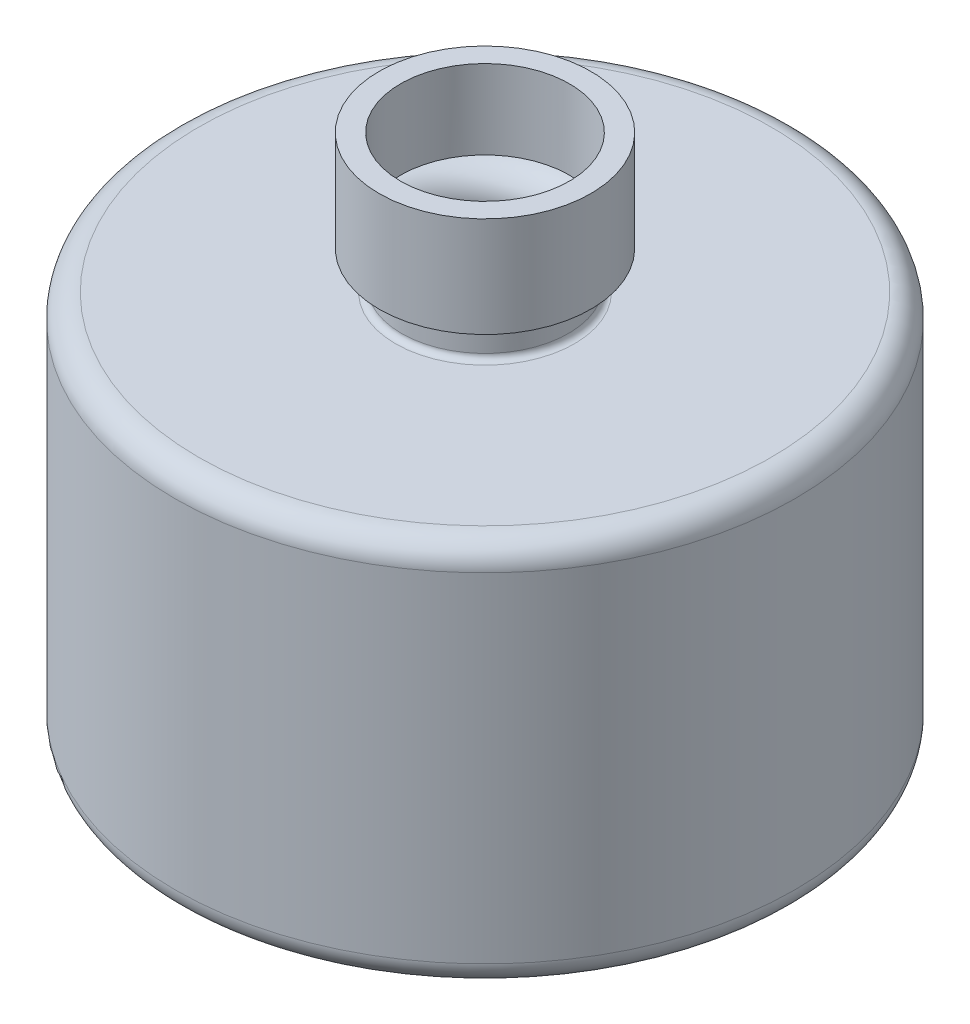
ISO-10303-21;
HEADER;
FILE_DESCRIPTION(('STEP AP214'),'2;1');
FILE_NAME('part.step','',(''),(''),'','','');
FILE_SCHEMA(('AUTOMOTIVE_DESIGN { 1 0 10303 214 1 1 1 1 }'));
ENDSEC;
DATA;
#1=APPLICATION_CONTEXT('core data for automotive mechanical design processes');
#2=APPLICATION_PROTOCOL_DEFINITION('international standard','automotive_design',2000,#1);
#3=PRODUCT_CONTEXT('',#1,'mechanical');
#4=PRODUCT('Part','Part','',(#3));
#5=PRODUCT_RELATED_PRODUCT_CATEGORY('part','',(#4));
#6=PRODUCT_DEFINITION_FORMATION('','',#4);
#7=PRODUCT_DEFINITION_CONTEXT('part definition',#1,'design');
#8=PRODUCT_DEFINITION('design','',#6,#7);
#9=PRODUCT_DEFINITION_SHAPE('','',#8);
#10=(LENGTH_UNIT() NAMED_UNIT(*) SI_UNIT(.MILLI.,.METRE.));
#11=(NAMED_UNIT(*) PLANE_ANGLE_UNIT() SI_UNIT($,.RADIAN.));
#12=(NAMED_UNIT(*) SI_UNIT($,.STERADIAN.) SOLID_ANGLE_UNIT());
#13=UNCERTAINTY_MEASURE_WITH_UNIT(LENGTH_MEASURE(1.E-05),#10,'distance_accuracy_value','');
#14=(GEOMETRIC_REPRESENTATION_CONTEXT(3) GLOBAL_UNCERTAINTY_ASSIGNED_CONTEXT((#13)) GLOBAL_UNIT_ASSIGNED_CONTEXT((#10,
#11,#12)) REPRESENTATION_CONTEXT('',''));
#15=CARTESIAN_POINT('',(0.,0.,0.));
#16=DIRECTION('',(0.,0.,1.));
#17=DIRECTION('',(1.,0.,0.));
#18=AXIS2_PLACEMENT_3D('',#15,#16,#17);
#19=CARTESIAN_POINT('',(0.,0.,0.));
#20=DIRECTION('',(0.,-1.,0.));
#21=DIRECTION('',(0.,0.,-1.));
#22=AXIS2_PLACEMENT_3D('',#19,#20,#21);
#23=PLANE('',#22);
#24=CARTESIAN_POINT('',(0.,0.,0.));
#25=DIRECTION('',(0.,-1.,0.));
#26=DIRECTION('',(0.,0.,-1.));
#27=AXIS2_PLACEMENT_3D('',#24,#25,#26);
#28=CIRCLE('',#27,15.24);
#29=CARTESIAN_POINT('',(0.,0.,-15.24));
#30=VERTEX_POINT('',#29);
#31=EDGE_CURVE('E58',#30,#30,#28,.T.);
#32=ORIENTED_EDGE('',*,*,#31,.T.);
#33=EDGE_LOOP('',(#32));
#34=FACE_BOUND('',#33,.T.);
#35=ADVANCED_FACE('F35',(#34),#23,.T.);
#36=CARTESIAN_POINT('',(0.,27.94,0.));
#37=DIRECTION('',(0.,1.,0.));
#38=DIRECTION('',(0.,0.,1.));
#39=AXIS2_PLACEMENT_3D('',#36,#37,#38);
#40=CYLINDRICAL_SURFACE('',#39,16.51);
#41=CARTESIAN_POINT('',(0.,1.27,0.));
#42=DIRECTION('',(0.,-1.,0.));
#43=DIRECTION('',(0.,0.,-1.));
#44=AXIS2_PLACEMENT_3D('',#41,#42,#43);
#45=CIRCLE('',#44,16.51);
#46=CARTESIAN_POINT('',(0.,1.27,-16.51));
#47=VERTEX_POINT('',#46);
#48=EDGE_CURVE('E61',#47,#47,#45,.F.);
#49=ORIENTED_EDGE('',*,*,#48,.T.);
#50=EDGE_LOOP('',(#49));
#51=FACE_BOUND('',#50,.T.);
#52=CARTESIAN_POINT('',(0.,19.304,0.));
#53=DIRECTION('',(0.,1.,0.));
#54=DIRECTION('',(0.,0.,1.));
#55=AXIS2_PLACEMENT_3D('',#52,#53,#54);
#56=CIRCLE('',#55,16.51);
#57=CARTESIAN_POINT('',(0.,19.304,16.51));
#58=VERTEX_POINT('',#57);
#59=EDGE_CURVE('E64',#58,#58,#56,.F.);
#60=ORIENTED_EDGE('',*,*,#59,.T.);
#61=EDGE_LOOP('',(#60));
#62=FACE_BOUND('',#61,.T.);
#63=ADVANCED_FACE('F118',(#51,#62),#40,.T.);
#64=CARTESIAN_POINT('',(-16.51,20.574,0.));
#65=DIRECTION('',(0.,1.,0.));
#66=DIRECTION('',(0.,0.,1.));
#67=AXIS2_PLACEMENT_3D('',#64,#65,#66);
#68=PLANE('',#67);
#69=CARTESIAN_POINT('',(0.,20.574,0.));
#70=DIRECTION('',(0.,1.,0.));
#71=DIRECTION('',(0.,0.,1.));
#72=AXIS2_PLACEMENT_3D('',#69,#70,#71);
#73=CIRCLE('',#72,4.7625);
#74=CARTESIAN_POINT('',(0.,20.574,4.7625));
#75=VERTEX_POINT('',#74);
#76=EDGE_CURVE('E46',#75,#75,#73,.F.);
#77=ORIENTED_EDGE('',*,*,#76,.T.);
#78=EDGE_LOOP('',(#77));
#79=FACE_BOUND('',#78,.T.);
#80=CARTESIAN_POINT('',(0.,20.574,0.));
#81=DIRECTION('',(0.,1.,0.));
#82=DIRECTION('',(0.,0.,1.));
#83=AXIS2_PLACEMENT_3D('',#80,#81,#82);
#84=CIRCLE('',#83,15.24);
#85=CARTESIAN_POINT('',(0.,20.574,15.24));
#86=VERTEX_POINT('',#85);
#87=EDGE_CURVE('E55',#86,#86,#84,.T.);
#88=ORIENTED_EDGE('',*,*,#87,.T.);
#89=EDGE_LOOP('',(#88));
#90=FACE_BOUND('',#89,.T.);
#91=ADVANCED_FACE('F124',(#79,#90),#68,.T.);
#92=CARTESIAN_POINT('',(0.,27.94,0.));
#93=DIRECTION('',(0.,1.,0.));
#94=DIRECTION('',(0.,0.,1.));
#95=AXIS2_PLACEMENT_3D('',#92,#93,#94);
#96=CYLINDRICAL_SURFACE('',#95,4.445);
#97=CARTESIAN_POINT('',(0.,22.2885,0.));
#98=DIRECTION('',(0.,-1.,0.));
#99=DIRECTION('',(0.,0.,-1.));
#100=AXIS2_PLACEMENT_3D('',#97,#98,#99);
#101=CIRCLE('',#100,4.445);
#102=CARTESIAN_POINT('',(0.,22.2885,-4.445));
#103=VERTEX_POINT('',#102);
#104=EDGE_CURVE('E12',#103,#103,#101,.T.);
#105=ORIENTED_EDGE('',*,*,#104,.T.);
#106=EDGE_LOOP('',(#105));
#107=FACE_BOUND('',#106,.T.);
#108=CARTESIAN_POINT('',(0.,20.8915,0.));
#109=DIRECTION('',(0.,1.,0.));
#110=DIRECTION('',(0.,0.,1.));
#111=AXIS2_PLACEMENT_3D('',#108,#109,#110);
#112=CIRCLE('',#111,4.445);
#113=CARTESIAN_POINT('',(0.,20.8915,4.445));
#114=VERTEX_POINT('',#113);
#115=EDGE_CURVE('E50',#114,#114,#112,.T.);
#116=ORIENTED_EDGE('',*,*,#115,.T.);
#117=EDGE_LOOP('',(#116));
#118=FACE_BOUND('',#117,.T.);
#119=ADVANCED_FACE('F145',(#107,#118),#96,.T.);
#120=CARTESIAN_POINT('',(-4.445,22.606,0.));
#121=DIRECTION('',(0.,-1.,0.));
#122=DIRECTION('',(0.,0.,-1.));
#123=AXIS2_PLACEMENT_3D('',#120,#121,#122);
#124=PLANE('',#123);
#125=CARTESIAN_POINT('',(0.,22.606,0.));
#126=DIRECTION('',(0.,-1.,0.));
#127=DIRECTION('',(0.,0.,-1.));
#128=AXIS2_PLACEMENT_3D('',#125,#126,#127);
#129=CIRCLE('',#128,4.7625);
#130=CARTESIAN_POINT('',(0.,22.606,-4.7625));
#131=VERTEX_POINT('',#130);
#132=EDGE_CURVE('E42',#131,#131,#129,.F.);
#133=ORIENTED_EDGE('',*,*,#132,.T.);
#134=EDGE_LOOP('',(#133));
#135=FACE_BOUND('',#134,.T.);
#136=CARTESIAN_POINT('',(0.,22.606,0.));
#137=DIRECTION('',(0.,1.,0.));
#138=DIRECTION('',(0.,0.,1.));
#139=AXIS2_PLACEMENT_3D('',#136,#137,#138);
#140=CIRCLE('',#139,5.63880000000001);
#141=CARTESIAN_POINT('',(0.,22.606,5.63880000000001));
#142=VERTEX_POINT('',#141);
#143=EDGE_CURVE('E67',#142,#142,#140,.T.);
#144=ORIENTED_EDGE('',*,*,#143,.F.);
#145=EDGE_LOOP('',(#144));
#146=FACE_BOUND('',#145,.T.);
#147=ADVANCED_FACE('F147',(#135,#146),#124,.T.);
#148=CARTESIAN_POINT('',(0.,27.94,0.));
#149=DIRECTION('',(0.,1.,0.));
#150=DIRECTION('',(0.,0.,1.));
#151=AXIS2_PLACEMENT_3D('',#148,#149,#150);
#152=CYLINDRICAL_SURFACE('',#151,5.63880000000001);
#153=ORIENTED_EDGE('',*,*,#143,.T.);
#154=EDGE_LOOP('',(#153));
#155=FACE_BOUND('',#154,.T.);
#156=CARTESIAN_POINT('',(0.,27.94,0.));
#157=DIRECTION('',(0.,1.,0.));
#158=DIRECTION('',(0.,0.,1.));
#159=AXIS2_PLACEMENT_3D('',#156,#157,#158);
#160=CIRCLE('',#159,5.63880000000001);
#161=CARTESIAN_POINT('',(0.,27.94,5.63880000000001));
#162=VERTEX_POINT('',#161);
#163=EDGE_CURVE('E70',#162,#162,#160,.T.);
#164=ORIENTED_EDGE('',*,*,#163,.F.);
#165=EDGE_LOOP('',(#164));
#166=FACE_BOUND('',#165,.T.);
#167=ADVANCED_FACE('F153',(#155,#166),#152,.T.);
#168=CARTESIAN_POINT('',(-5.63880000000001,27.94,0.));
#169=DIRECTION('',(0.,1.,0.));
#170=DIRECTION('',(0.,0.,1.));
#171=AXIS2_PLACEMENT_3D('',#168,#169,#170);
#172=PLANE('',#171);
#173=CARTESIAN_POINT('',(0.,27.94,0.));
#174=DIRECTION('',(0.,1.,0.));
#175=DIRECTION('',(0.,0.,1.));
#176=AXIS2_PLACEMENT_3D('',#173,#174,#175);
#177=CIRCLE('',#176,4.49580000000001);
#178=CARTESIAN_POINT('',(0.,27.94,4.49580000000001));
#179=VERTEX_POINT('',#178);
#180=EDGE_CURVE('E78',#179,#179,#177,.T.);
#181=ORIENTED_EDGE('',*,*,#180,.F.);
#182=EDGE_LOOP('',(#181));
#183=FACE_BOUND('',#182,.T.);
#184=ORIENTED_EDGE('',*,*,#163,.T.);
#185=EDGE_LOOP('',(#184));
#186=FACE_BOUND('',#185,.T.);
#187=ADVANCED_FACE('F133',(#183,#186),#172,.T.);
#188=CARTESIAN_POINT('',(0.,1.27,0.));
#189=DIRECTION('',(0.,-1.,0.));
#190=DIRECTION('',(0.,0.,-1.));
#191=AXIS2_PLACEMENT_3D('',#188,#189,#190);
#192=TOROIDAL_SURFACE('',#191,15.24,1.27);
#193=ORIENTED_EDGE('',*,*,#31,.F.);
#194=EDGE_LOOP('',(#193));
#195=FACE_BOUND('',#194,.T.);
#196=ORIENTED_EDGE('',*,*,#48,.F.);
#197=EDGE_LOOP('',(#196));
#198=FACE_BOUND('',#197,.T.);
#199=ADVANCED_FACE('F129',(#195,#198),#192,.T.);
#200=CARTESIAN_POINT('',(0.,19.304,0.));
#201=DIRECTION('',(0.,1.,0.));
#202=DIRECTION('',(0.,0.,1.));
#203=AXIS2_PLACEMENT_3D('',#200,#201,#202);
#204=TOROIDAL_SURFACE('',#203,15.24,1.27);
#205=ORIENTED_EDGE('',*,*,#59,.F.);
#206=EDGE_LOOP('',(#205));
#207=FACE_BOUND('',#206,.T.);
#208=ORIENTED_EDGE('',*,*,#87,.F.);
#209=EDGE_LOOP('',(#208));
#210=FACE_BOUND('',#209,.T.);
#211=ADVANCED_FACE('F132',(#207,#210),#204,.T.);
#212=CARTESIAN_POINT('',(0.,20.8915,0.));
#213=DIRECTION('',(0.,1.,0.));
#214=DIRECTION('',(0.,0.,1.));
#215=AXIS2_PLACEMENT_3D('',#212,#213,#214);
#216=TOROIDAL_SURFACE('',#215,4.7625,0.3175);
#217=ORIENTED_EDGE('',*,*,#76,.F.);
#218=EDGE_LOOP('',(#217));
#219=FACE_BOUND('',#218,.T.);
#220=ORIENTED_EDGE('',*,*,#115,.F.);
#221=EDGE_LOOP('',(#220));
#222=FACE_BOUND('',#221,.T.);
#223=ADVANCED_FACE('F115',(#219,#222),#216,.F.);
#224=CARTESIAN_POINT('',(0.,22.2885,0.));
#225=DIRECTION('',(0.,-1.,0.));
#226=DIRECTION('',(0.,0.,-1.));
#227=AXIS2_PLACEMENT_3D('',#224,#225,#226);
#228=TOROIDAL_SURFACE('',#227,4.7625,0.3175);
#229=ORIENTED_EDGE('',*,*,#104,.F.);
#230=EDGE_LOOP('',(#229));
#231=FACE_BOUND('',#230,.T.);
#232=ORIENTED_EDGE('',*,*,#132,.F.);
#233=EDGE_LOOP('',(#232));
#234=FACE_BOUND('',#233,.T.);
#235=ADVANCED_FACE('F37',(#231,#234),#228,.F.);
#236=CARTESIAN_POINT('',(0.,1.143,0.));
#237=DIRECTION('',(0.,-1.,0.));
#238=DIRECTION('',(0.,0.,-1.));
#239=AXIS2_PLACEMENT_3D('',#236,#237,#238);
#240=PLANE('',#239);
#241=CARTESIAN_POINT('',(0.,1.143,0.));
#242=DIRECTION('',(0.,-1.,0.));
#243=DIRECTION('',(0.,0.,-1.));
#244=AXIS2_PLACEMENT_3D('',#241,#242,#243);
#245=CIRCLE('',#244,15.24);
#246=CARTESIAN_POINT('',(0.,1.143,-15.24));
#247=VERTEX_POINT('',#246);
#248=EDGE_CURVE('E92',#247,#247,#245,.T.);
#249=ORIENTED_EDGE('',*,*,#248,.F.);
#250=EDGE_LOOP('',(#249));
#251=FACE_BOUND('',#250,.T.);
#252=ADVANCED_FACE('F104',(#251),#240,.F.);
#253=CARTESIAN_POINT('',(0.,27.94,0.));
#254=DIRECTION('',(0.,1.,0.));
#255=DIRECTION('',(0.,0.,1.));
#256=AXIS2_PLACEMENT_3D('',#253,#254,#255);
#257=CYLINDRICAL_SURFACE('',#256,15.367);
#258=CARTESIAN_POINT('',(0.,1.27,0.));
#259=DIRECTION('',(0.,1.,0.));
#260=DIRECTION('',(0.,0.,1.));
#261=AXIS2_PLACEMENT_3D('',#258,#259,#260);
#262=CIRCLE('',#261,15.367);
#263=CARTESIAN_POINT('',(0.,1.27,15.367));
#264=VERTEX_POINT('',#263);
#265=EDGE_CURVE('E95',#264,#264,#262,.T.);
#266=ORIENTED_EDGE('',*,*,#265,.F.);
#267=EDGE_LOOP('',(#266));
#268=FACE_BOUND('',#267,.T.);
#269=CARTESIAN_POINT('',(0.,19.304,0.));
#270=DIRECTION('',(0.,1.,0.));
#271=DIRECTION('',(0.,0.,1.));
#272=AXIS2_PLACEMENT_3D('',#269,#270,#271);
#273=CIRCLE('',#272,15.367);
#274=CARTESIAN_POINT('',(0.,19.304,15.367));
#275=VERTEX_POINT('',#274);
#276=EDGE_CURVE('E81',#275,#275,#273,.F.);
#277=ORIENTED_EDGE('',*,*,#276,.F.);
#278=EDGE_LOOP('',(#277));
#279=FACE_BOUND('',#278,.T.);
#280=ADVANCED_FACE('F106',(#268,#279),#257,.F.);
#281=CARTESIAN_POINT('',(-16.51,19.431,0.));
#282=DIRECTION('',(0.,1.,0.));
#283=DIRECTION('',(0.,0.,1.));
#284=AXIS2_PLACEMENT_3D('',#281,#282,#283);
#285=PLANE('',#284);
#286=CARTESIAN_POINT('',(0.,19.431,0.));
#287=DIRECTION('',(0.,1.,0.));
#288=DIRECTION('',(0.,0.,1.));
#289=AXIS2_PLACEMENT_3D('',#286,#287,#288);
#290=CIRCLE('',#289,4.7625);
#291=CARTESIAN_POINT('',(0.,19.431,4.7625));
#292=VERTEX_POINT('',#291);
#293=EDGE_CURVE('E77',#292,#292,#290,.F.);
#294=ORIENTED_EDGE('',*,*,#293,.F.);
#295=EDGE_LOOP('',(#294));
#296=FACE_BOUND('',#295,.T.);
#297=CARTESIAN_POINT('',(0.,19.431,0.));
#298=DIRECTION('',(0.,1.,0.));
#299=DIRECTION('',(0.,0.,1.));
#300=AXIS2_PLACEMENT_3D('',#297,#298,#299);
#301=CIRCLE('',#300,15.24);
#302=CARTESIAN_POINT('',(0.,19.431,15.24));
#303=VERTEX_POINT('',#302);
#304=EDGE_CURVE('E87',#303,#303,#301,.T.);
#305=ORIENTED_EDGE('',*,*,#304,.F.);
#306=EDGE_LOOP('',(#305));
#307=FACE_BOUND('',#306,.T.);
#308=ADVANCED_FACE('F112',(#296,#307),#285,.F.);
#309=CARTESIAN_POINT('',(0.,27.94,0.));
#310=DIRECTION('',(0.,1.,0.));
#311=DIRECTION('',(0.,0.,1.));
#312=AXIS2_PLACEMENT_3D('',#309,#310,#311);
#313=CYLINDRICAL_SURFACE('',#312,3.302);
#314=CARTESIAN_POINT('',(0.,22.2885,0.));
#315=DIRECTION('',(0.,1.,0.));
#316=DIRECTION('',(0.,0.,1.));
#317=AXIS2_PLACEMENT_3D('',#314,#315,#316);
#318=CIRCLE('',#317,3.302);
#319=CARTESIAN_POINT('',(0.,22.2885,3.302));
#320=VERTEX_POINT('',#319);
#321=EDGE_CURVE('E73',#320,#320,#318,.F.);
#322=ORIENTED_EDGE('',*,*,#321,.F.);
#323=EDGE_LOOP('',(#322));
#324=FACE_BOUND('',#323,.T.);
#325=CARTESIAN_POINT('',(0.,20.8915,0.));
#326=DIRECTION('',(0.,1.,0.));
#327=DIRECTION('',(0.,0.,1.));
#328=AXIS2_PLACEMENT_3D('',#325,#326,#327);
#329=CIRCLE('',#328,3.302);
#330=CARTESIAN_POINT('',(0.,20.8915,3.302));
#331=VERTEX_POINT('',#330);
#332=EDGE_CURVE('E84',#331,#331,#329,.T.);
#333=ORIENTED_EDGE('',*,*,#332,.F.);
#334=EDGE_LOOP('',(#333));
#335=FACE_BOUND('',#334,.T.);
#336=ADVANCED_FACE('F166',(#324,#335),#313,.F.);
#337=CARTESIAN_POINT('',(0.,27.94,0.));
#338=DIRECTION('',(0.,1.,0.));
#339=DIRECTION('',(0.,0.,1.));
#340=AXIS2_PLACEMENT_3D('',#337,#338,#339);
#341=CYLINDRICAL_SURFACE('',#340,4.49580000000001);
#342=ORIENTED_EDGE('',*,*,#180,.T.);
#343=EDGE_LOOP('',(#342));
#344=FACE_BOUND('',#343,.T.);
#345=CARTESIAN_POINT('',(0.,23.7244426729504,0.));
#346=DIRECTION('',(0.,-1.,0.));
#347=DIRECTION('',(0.,0.,-1.));
#348=AXIS2_PLACEMENT_3D('',#345,#346,#347);
#349=CIRCLE('',#348,4.49580000000001);
#350=CARTESIAN_POINT('',(0.,23.7244426729504,-4.49580000000001));
#351=VERTEX_POINT('',#350);
#352=EDGE_CURVE('E74',#351,#351,#349,.F.);
#353=ORIENTED_EDGE('',*,*,#352,.F.);
#354=EDGE_LOOP('',(#353));
#355=FACE_BOUND('',#354,.T.);
#356=ADVANCED_FACE('F163',(#344,#355),#341,.F.);
#357=CARTESIAN_POINT('',(0.,1.27,0.));
#358=DIRECTION('',(0.,-1.,0.));
#359=DIRECTION('',(0.,0.,-1.));
#360=AXIS2_PLACEMENT_3D('',#357,#358,#359);
#361=TOROIDAL_SURFACE('',#360,15.24,0.127);
#362=ORIENTED_EDGE('',*,*,#248,.T.);
#363=EDGE_LOOP('',(#362));
#364=FACE_BOUND('',#363,.T.);
#365=ORIENTED_EDGE('',*,*,#265,.T.);
#366=EDGE_LOOP('',(#365));
#367=FACE_BOUND('',#366,.T.);
#368=ADVANCED_FACE('F101',(#364,#367),#361,.F.);
#369=CARTESIAN_POINT('',(0.,19.304,0.));
#370=DIRECTION('',(0.,1.,0.));
#371=DIRECTION('',(0.,0.,1.));
#372=AXIS2_PLACEMENT_3D('',#369,#370,#371);
#373=TOROIDAL_SURFACE('',#372,15.24,0.127);
#374=ORIENTED_EDGE('',*,*,#276,.T.);
#375=EDGE_LOOP('',(#374));
#376=FACE_BOUND('',#375,.T.);
#377=ORIENTED_EDGE('',*,*,#304,.T.);
#378=EDGE_LOOP('',(#377));
#379=FACE_BOUND('',#378,.T.);
#380=ADVANCED_FACE('F175',(#376,#379),#373,.F.);
#381=CARTESIAN_POINT('',(0.,20.8915,0.));
#382=DIRECTION('',(0.,1.,0.));
#383=DIRECTION('',(0.,0.,1.));
#384=AXIS2_PLACEMENT_3D('',#381,#382,#383);
#385=TOROIDAL_SURFACE('',#384,4.7625,1.4605);
#386=ORIENTED_EDGE('',*,*,#293,.T.);
#387=EDGE_LOOP('',(#386));
#388=FACE_BOUND('',#387,.T.);
#389=ORIENTED_EDGE('',*,*,#332,.T.);
#390=EDGE_LOOP('',(#389));
#391=FACE_BOUND('',#390,.T.);
#392=ADVANCED_FACE('F171',(#388,#391),#385,.T.);
#393=CARTESIAN_POINT('',(0.,22.2885,0.));
#394=DIRECTION('',(0.,-1.,0.));
#395=DIRECTION('',(0.,0.,-1.));
#396=AXIS2_PLACEMENT_3D('',#393,#394,#395);
#397=TOROIDAL_SURFACE('',#396,4.7625,1.4605);
#398=ORIENTED_EDGE('',*,*,#321,.T.);
#399=EDGE_LOOP('',(#398));
#400=FACE_BOUND('',#399,.T.);
#401=ORIENTED_EDGE('',*,*,#352,.T.);
#402=EDGE_LOOP('',(#401));
#403=FACE_BOUND('',#402,.T.);
#404=ADVANCED_FACE('F168',(#400,#403),#397,.T.);
#405=CLOSED_SHELL('',(#35,#63,#91,#119,#147,#167,#187,#199,#211,#223,#235,#252,#280,#308,#336,
#356,#368,#380,#392,#404));
#406=MANIFOLD_SOLID_BREP('B2',#405);
#407=ADVANCED_BREP_SHAPE_REPRESENTATION('',(#18,#406),#14);
#408=SHAPE_DEFINITION_REPRESENTATION(#9,#407);
ENDSEC;
END-ISO-10303-21;
